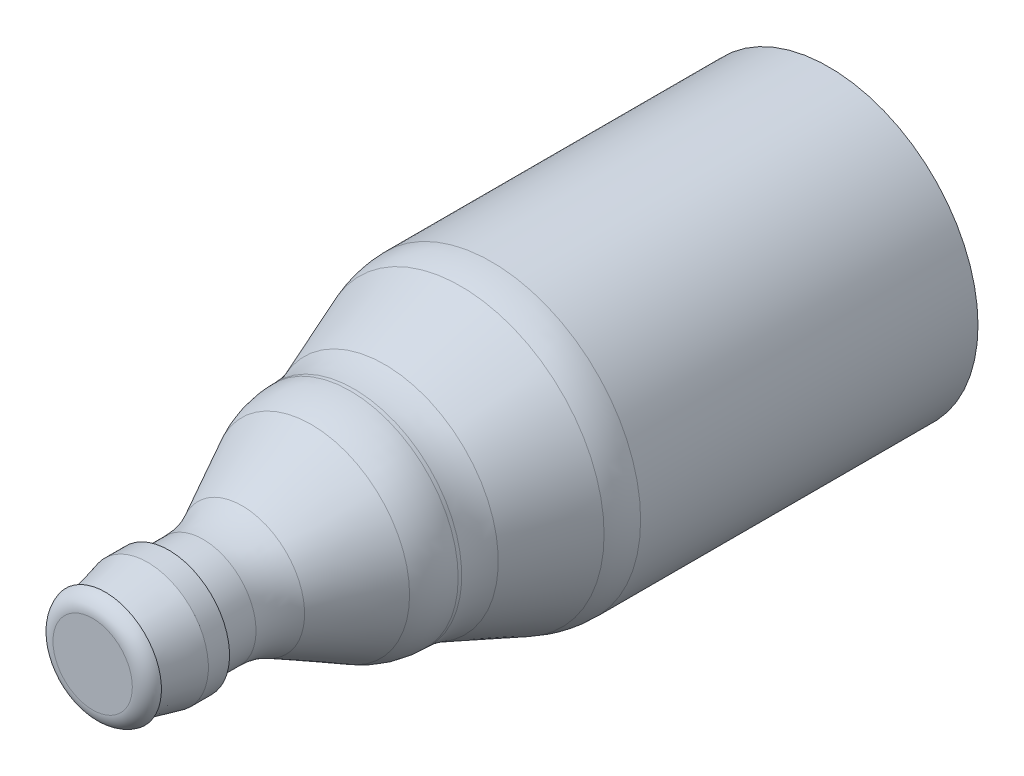
ISO-10303-21;
HEADER;
FILE_DESCRIPTION(('STEP AP214'),'2;1');
FILE_NAME('part.step','',(''),(''),'','','');
FILE_SCHEMA(('AUTOMOTIVE_DESIGN { 1 0 10303 214 1 1 1 1 }'));
ENDSEC;
DATA;
#1=APPLICATION_CONTEXT('core data for automotive mechanical design processes');
#2=APPLICATION_PROTOCOL_DEFINITION('international standard','automotive_design',2000,#1);
#3=PRODUCT_CONTEXT('',#1,'mechanical');
#4=PRODUCT('Part','Part','',(#3));
#5=PRODUCT_RELATED_PRODUCT_CATEGORY('part','',(#4));
#6=PRODUCT_DEFINITION_FORMATION('','',#4);
#7=PRODUCT_DEFINITION_CONTEXT('part definition',#1,'design');
#8=PRODUCT_DEFINITION('design','',#6,#7);
#9=PRODUCT_DEFINITION_SHAPE('','',#8);
#10=(LENGTH_UNIT() NAMED_UNIT(*) SI_UNIT(.MILLI.,.METRE.));
#11=(NAMED_UNIT(*) PLANE_ANGLE_UNIT() SI_UNIT($,.RADIAN.));
#12=(NAMED_UNIT(*) SI_UNIT($,.STERADIAN.) SOLID_ANGLE_UNIT());
#13=UNCERTAINTY_MEASURE_WITH_UNIT(LENGTH_MEASURE(1.E-05),#10,'distance_accuracy_value','');
#14=(GEOMETRIC_REPRESENTATION_CONTEXT(3) GLOBAL_UNCERTAINTY_ASSIGNED_CONTEXT((#13)) GLOBAL_UNIT_ASSIGNED_CONTEXT((#10,
#11,#12)) REPRESENTATION_CONTEXT('',''));
#15=CARTESIAN_POINT('',(0.,0.,0.));
#16=DIRECTION('',(0.,0.,1.));
#17=DIRECTION('',(1.,0.,0.));
#18=AXIS2_PLACEMENT_3D('',#15,#16,#17);
#19=CARTESIAN_POINT('',(0.,0.,10.));
#20=DIRECTION('',(0.,0.,-1.));
#21=DIRECTION('',(-1.,0.,0.));
#22=AXIS2_PLACEMENT_3D('',#19,#20,#21);
#23=CYLINDRICAL_SURFACE('',#22,35.25);
#24=CARTESIAN_POINT('',(0.,0.,79.7379890800758));
#25=DIRECTION('',(0.,0.,1.));
#26=DIRECTION('',(1.,0.,0.));
#27=AXIS2_PLACEMENT_3D('',#24,#25,#26);
#28=CIRCLE('',#27,35.25);
#29=CARTESIAN_POINT('',(35.25,0.,79.7379890800758));
#30=VERTEX_POINT('',#29);
#31=EDGE_CURVE('E10',#30,#30,#28,.F.);
#32=ORIENTED_EDGE('',*,*,#31,.T.);
#33=EDGE_LOOP('',(#32));
#34=FACE_BOUND('',#33,.T.);
#35=CARTESIAN_POINT('',(0.,0.,0.));
#36=DIRECTION('',(0.,0.,1.));
#37=DIRECTION('',(1.,0.,0.));
#38=AXIS2_PLACEMENT_3D('',#35,#36,#37);
#39=CIRCLE('',#38,35.25);
#40=CARTESIAN_POINT('',(35.25,0.,0.));
#41=VERTEX_POINT('',#40);
#42=EDGE_CURVE('E65',#41,#41,#39,.T.);
#43=ORIENTED_EDGE('',*,*,#42,.T.);
#44=EDGE_LOOP('',(#43));
#45=FACE_BOUND('',#44,.T.);
#46=ADVANCED_FACE('F30',(#34,#45),#23,.T.);
#47=CARTESIAN_POINT('',(0.,0.,0.));
#48=DIRECTION('',(0.,0.,1.));
#49=DIRECTION('',(1.,0.,0.));
#50=AXIS2_PLACEMENT_3D('',#47,#48,#49);
#51=PLANE('',#50);
#52=ORIENTED_EDGE('',*,*,#42,.F.);
#53=EDGE_LOOP('',(#52));
#54=FACE_BOUND('',#53,.T.);
#55=ADVANCED_FACE('F105',(#54),#51,.F.);
#56=CARTESIAN_POINT('',(0.,0.,83.5));
#57=DIRECTION('',(0.,0.,-1.));
#58=DIRECTION('',(-1.,0.,0.));
#59=AXIS2_PLACEMENT_3D('',#56,#57,#58);
#60=CONICAL_SURFACE('',#59,35.25,0.371856073848581);
#61=CARTESIAN_POINT('',(0.,0.,104.995105390091));
#62=DIRECTION('',(0.,0.,-1.));
#63=DIRECTION('',(-1.,0.,0.));
#64=AXIS2_PLACEMENT_3D('',#61,#62,#63);
#65=CIRCLE('',#64,26.8669088978644);
#66=CARTESIAN_POINT('',(-26.8669088978644,0.,104.995105390091));
#67=VERTEX_POINT('',#66);
#68=EDGE_CURVE('E45',#67,#67,#65,.T.);
#69=ORIENTED_EDGE('',*,*,#68,.T.);
#70=EDGE_LOOP('',(#69));
#71=FACE_BOUND('',#70,.T.);
#72=CARTESIAN_POINT('',(0.,0.,87.0048946099087));
#73=DIRECTION('',(0.,0.,-1.));
#74=DIRECTION('',(-1.,0.,0.));
#75=AXIS2_PLACEMENT_3D('',#72,#73,#74);
#76=CIRCLE('',#75,33.8830911021356);
#77=CARTESIAN_POINT('',(-33.8830911021356,0.,87.0048946099087));
#78=VERTEX_POINT('',#77);
#79=EDGE_CURVE('E50',#78,#78,#76,.F.);
#80=ORIENTED_EDGE('',*,*,#79,.T.);
#81=EDGE_LOOP('',(#80));
#82=FACE_BOUND('',#81,.T.);
#83=ADVANCED_FACE('F109',(#71,#82),#60,.T.);
#84=CARTESIAN_POINT('',(0.,0.,0.));
#85=DIRECTION('',(0.,0.,-1.));
#86=DIRECTION('',(-1.,0.,0.));
#87=AXIS2_PLACEMENT_3D('',#84,#85,#86);
#88=CYLINDRICAL_SURFACE('',#87,25.5);
#89=CARTESIAN_POINT('',(0.,0.,112.262010919924));
#90=DIRECTION('',(0.,0.,-1.));
#91=DIRECTION('',(-1.,0.,0.));
#92=AXIS2_PLACEMENT_3D('',#89,#90,#91);
#93=CIRCLE('',#92,25.5);
#94=CARTESIAN_POINT('',(-25.5,0.,112.262010919924));
#95=VERTEX_POINT('',#94);
#96=EDGE_CURVE('E37',#95,#95,#93,.F.);
#97=ORIENTED_EDGE('',*,*,#96,.T.);
#98=EDGE_LOOP('',(#97));
#99=FACE_BOUND('',#98,.T.);
#100=CARTESIAN_POINT('',(0.,0.,113.110760604291));
#101=DIRECTION('',(0.,0.,1.));
#102=DIRECTION('',(1.,0.,0.));
#103=AXIS2_PLACEMENT_3D('',#100,#101,#102);
#104=CIRCLE('',#103,25.5);
#105=CARTESIAN_POINT('',(25.5,0.,113.110760604291));
#106=VERTEX_POINT('',#105);
#107=EDGE_CURVE('E41',#106,#106,#104,.F.);
#108=ORIENTED_EDGE('',*,*,#107,.T.);
#109=EDGE_LOOP('',(#108));
#110=FACE_BOUND('',#109,.T.);
#111=ADVANCED_FACE('F116',(#99,#110),#88,.T.);
#112=CARTESIAN_POINT('',(0.,0.,118.));
#113=DIRECTION('',(0.,0.,-1.));
#114=DIRECTION('',(-1.,0.,0.));
#115=AXIS2_PLACEMENT_3D('',#112,#113,#114);
#116=CONICAL_SURFACE('',#115,25.5,0.479519291992596);
#117=CARTESIAN_POINT('',(0.,0.,138.662184662869));
#118=DIRECTION('',(0.,0.,-1.));
#119=DIRECTION('',(-1.,0.,0.));
#120=AXIS2_PLACEMENT_3D('',#117,#118,#119);
#121=CIRCLE('',#120,14.7556639753081);
#122=CARTESIAN_POINT('',(-14.7556639753081,0.,138.662184662869));
#123=VERTEX_POINT('',#122);
#124=EDGE_CURVE('E56',#123,#123,#121,.T.);
#125=ORIENTED_EDGE('',*,*,#124,.T.);
#126=EDGE_LOOP('',(#125));
#127=FACE_BOUND('',#126,.T.);
#128=CARTESIAN_POINT('',(0.,0.,122.337815337131));
#129=DIRECTION('',(0.,0.,1.));
#130=DIRECTION('',(1.,0.,0.));
#131=AXIS2_PLACEMENT_3D('',#128,#129,#130);
#132=CIRCLE('',#131,23.2443360246919);
#133=CARTESIAN_POINT('',(23.2443360246919,0.,122.337815337131));
#134=VERTEX_POINT('',#133);
#135=EDGE_CURVE('E59',#134,#134,#132,.T.);
#136=ORIENTED_EDGE('',*,*,#135,.T.);
#137=EDGE_LOOP('',(#136));
#138=FACE_BOUND('',#137,.T.);
#139=ADVANCED_FACE('F120',(#127,#138),#116,.T.);
#140=CARTESIAN_POINT('',(0.,0.,0.));
#141=DIRECTION('',(0.,0.,-1.));
#142=DIRECTION('',(-1.,0.,0.));
#143=AXIS2_PLACEMENT_3D('',#140,#141,#142);
#144=CYLINDRICAL_SURFACE('',#143,12.5);
#145=CARTESIAN_POINT('',(0.,0.,147.889239395709));
#146=DIRECTION('',(0.,0.,-1.));
#147=DIRECTION('',(-1.,0.,0.));
#148=AXIS2_PLACEMENT_3D('',#145,#146,#147);
#149=CIRCLE('',#148,12.5);
#150=CARTESIAN_POINT('',(-12.5,0.,147.889239395709));
#151=VERTEX_POINT('',#150);
#152=EDGE_CURVE('E53',#151,#151,#149,.F.);
#153=ORIENTED_EDGE('',*,*,#152,.T.);
#154=EDGE_LOOP('',(#153));
#155=FACE_BOUND('',#154,.T.);
#156=CARTESIAN_POINT('',(0.,0.,156.));
#157=DIRECTION('',(0.,0.,-1.));
#158=DIRECTION('',(-1.,0.,0.));
#159=AXIS2_PLACEMENT_3D('',#156,#157,#158);
#160=CIRCLE('',#159,12.5);
#161=CARTESIAN_POINT('',(-12.5,0.,156.));
#162=VERTEX_POINT('',#161);
#163=EDGE_CURVE('E68',#162,#162,#160,.T.);
#164=ORIENTED_EDGE('',*,*,#163,.T.);
#165=EDGE_LOOP('',(#164));
#166=FACE_BOUND('',#165,.T.);
#167=ADVANCED_FACE('F123',(#155,#166),#144,.T.);
#168=CARTESIAN_POINT('',(-12.5,0.,156.));
#169=DIRECTION('',(0.,0.,-1.));
#170=DIRECTION('',(-1.,0.,0.));
#171=AXIS2_PLACEMENT_3D('',#168,#169,#170);
#172=PLANE('',#171);
#173=CARTESIAN_POINT('',(0.,0.,156.));
#174=DIRECTION('',(0.,0.,-1.));
#175=DIRECTION('',(-1.,0.,0.));
#176=AXIS2_PLACEMENT_3D('',#173,#174,#175);
#177=CIRCLE('',#176,14.35);
#178=CARTESIAN_POINT('',(-14.35,0.,156.));
#179=VERTEX_POINT('',#178);
#180=EDGE_CURVE('E71',#179,#179,#177,.T.);
#181=ORIENTED_EDGE('',*,*,#180,.T.);
#182=EDGE_LOOP('',(#181));
#183=FACE_BOUND('',#182,.T.);
#184=ORIENTED_EDGE('',*,*,#163,.F.);
#185=EDGE_LOOP('',(#184));
#186=FACE_BOUND('',#185,.T.);
#187=ADVANCED_FACE('F127',(#183,#186),#172,.T.);
#188=CARTESIAN_POINT('',(0.,0.,0.));
#189=DIRECTION('',(0.,0.,-1.));
#190=DIRECTION('',(-1.,0.,0.));
#191=AXIS2_PLACEMENT_3D('',#188,#189,#190);
#192=CYLINDRICAL_SURFACE('',#191,14.35);
#193=CARTESIAN_POINT('',(0.,0.,161.));
#194=DIRECTION('',(0.,0.,-1.));
#195=DIRECTION('',(-1.,0.,0.));
#196=AXIS2_PLACEMENT_3D('',#193,#194,#195);
#197=CIRCLE('',#196,14.35);
#198=CARTESIAN_POINT('',(-14.35,0.,161.));
#199=VERTEX_POINT('',#198);
#200=EDGE_CURVE('E74',#199,#199,#197,.T.);
#201=ORIENTED_EDGE('',*,*,#200,.T.);
#202=EDGE_LOOP('',(#201));
#203=FACE_BOUND('',#202,.T.);
#204=ORIENTED_EDGE('',*,*,#180,.F.);
#205=EDGE_LOOP('',(#204));
#206=FACE_BOUND('',#205,.T.);
#207=ADVANCED_FACE('F131',(#203,#206),#192,.T.);
#208=CARTESIAN_POINT('',(0.,0.,161.));
#209=DIRECTION('',(0.,0.,-1.));
#210=DIRECTION('',(-1.,0.,0.));
#211=AXIS2_PLACEMENT_3D('',#208,#209,#210);
#212=CONICAL_SURFACE('',#211,14.35,0.230811960402668);
#213=CARTESIAN_POINT('',(0.,0.,171.));
#214=DIRECTION('',(0.,0.,-1.));
#215=DIRECTION('',(-1.,0.,0.));
#216=AXIS2_PLACEMENT_3D('',#213,#214,#215);
#217=CIRCLE('',#216,12.);
#218=CARTESIAN_POINT('',(-12.,0.,171.));
#219=VERTEX_POINT('',#218);
#220=EDGE_CURVE('E77',#219,#219,#217,.T.);
#221=ORIENTED_EDGE('',*,*,#220,.T.);
#222=EDGE_LOOP('',(#221));
#223=FACE_BOUND('',#222,.T.);
#224=ORIENTED_EDGE('',*,*,#200,.F.);
#225=EDGE_LOOP('',(#224));
#226=FACE_BOUND('',#225,.T.);
#227=ADVANCED_FACE('F135',(#223,#226),#212,.T.);
#228=CARTESIAN_POINT('',(-12.,0.,171.));
#229=DIRECTION('',(0.,0.,-1.));
#230=DIRECTION('',(-1.,0.,0.));
#231=AXIS2_PLACEMENT_3D('',#228,#229,#230);
#232=PLANE('',#231);
#233=CARTESIAN_POINT('',(0.,0.,171.));
#234=DIRECTION('',(0.,0.,-1.));
#235=DIRECTION('',(-1.,0.,0.));
#236=AXIS2_PLACEMENT_3D('',#233,#234,#235);
#237=CIRCLE('',#236,13.25);
#238=CARTESIAN_POINT('',(-13.25,0.,171.));
#239=VERTEX_POINT('',#238);
#240=EDGE_CURVE('E80',#239,#239,#237,.T.);
#241=ORIENTED_EDGE('',*,*,#240,.T.);
#242=EDGE_LOOP('',(#241));
#243=FACE_BOUND('',#242,.T.);
#244=ORIENTED_EDGE('',*,*,#220,.F.);
#245=EDGE_LOOP('',(#244));
#246=FACE_BOUND('',#245,.T.);
#247=ADVANCED_FACE('F84',(#243,#246),#232,.T.);
#248=CARTESIAN_POINT('',(-12.5,0.,174.));
#249=DIRECTION('',(0.,0.,1.));
#250=DIRECTION('',(1.,0.,0.));
#251=AXIS2_PLACEMENT_3D('',#248,#249,#250);
#252=PLANE('',#251);
#253=CARTESIAN_POINT('',(0.,0.,174.));
#254=DIRECTION('',(0.,0.,1.));
#255=DIRECTION('',(1.,0.,0.));
#256=AXIS2_PLACEMENT_3D('',#253,#254,#255);
#257=CIRCLE('',#256,9.37701665379256);
#258=CARTESIAN_POINT('',(9.37701665379256,0.,174.));
#259=VERTEX_POINT('',#258);
#260=EDGE_CURVE('E62',#259,#259,#257,.T.);
#261=ORIENTED_EDGE('',*,*,#260,.T.);
#262=EDGE_LOOP('',(#261));
#263=FACE_BOUND('',#262,.T.);
#264=ADVANCED_FACE('F90',(#263),#252,.T.);
#265=CARTESIAN_POINT('',(0.,0.,170.));
#266=DIRECTION('',(0.,0.,-1.));
#267=DIRECTION('',(-1.,0.,0.));
#268=AXIS2_PLACEMENT_3D('',#265,#266,#267);
#269=TOROIDAL_SURFACE('',#268,9.37701665379256,4.);
#270=ORIENTED_EDGE('',*,*,#260,.F.);
#271=EDGE_LOOP('',(#270));
#272=FACE_BOUND('',#271,.T.);
#273=ORIENTED_EDGE('',*,*,#240,.F.);
#274=EDGE_LOOP('',(#273));
#275=FACE_BOUND('',#274,.T.);
#276=ADVANCED_FACE('F87',(#272,#275),#269,.T.);
#277=CARTESIAN_POINT('',(0.,0.,147.889239395709));
#278=DIRECTION('',(0.,0.,-1.));
#279=DIRECTION('',(-1.,0.,0.));
#280=AXIS2_PLACEMENT_3D('',#277,#278,#279);
#281=TOROIDAL_SURFACE('',#280,32.5,20.);
#282=ORIENTED_EDGE('',*,*,#152,.F.);
#283=EDGE_LOOP('',(#282));
#284=FACE_BOUND('',#283,.T.);
#285=ORIENTED_EDGE('',*,*,#124,.F.);
#286=EDGE_LOOP('',(#285));
#287=FACE_BOUND('',#286,.T.);
#288=ADVANCED_FACE('F89',(#284,#287),#281,.F.);
#289=CARTESIAN_POINT('',(0.,0.,112.262010919924));
#290=DIRECTION('',(0.,0.,-1.));
#291=DIRECTION('',(-1.,0.,0.));
#292=AXIS2_PLACEMENT_3D('',#289,#290,#291);
#293=TOROIDAL_SURFACE('',#292,45.5,20.);
#294=ORIENTED_EDGE('',*,*,#96,.F.);
#295=EDGE_LOOP('',(#294));
#296=FACE_BOUND('',#295,.T.);
#297=ORIENTED_EDGE('',*,*,#68,.F.);
#298=EDGE_LOOP('',(#297));
#299=FACE_BOUND('',#298,.T.);
#300=ADVANCED_FACE('F97',(#296,#299),#293,.F.);
#301=CARTESIAN_POINT('',(0.,0.,79.7379890800758));
#302=DIRECTION('',(0.,0.,1.));
#303=DIRECTION('',(1.,0.,0.));
#304=AXIS2_PLACEMENT_3D('',#301,#302,#303);
#305=DEGENERATE_TOROIDAL_SURFACE('',#304,15.25,20.,.T.);
#306=ORIENTED_EDGE('',*,*,#79,.F.);
#307=EDGE_LOOP('',(#306));
#308=FACE_BOUND('',#307,.T.);
#309=ORIENTED_EDGE('',*,*,#31,.F.);
#310=EDGE_LOOP('',(#309));
#311=FACE_BOUND('',#310,.T.);
#312=ADVANCED_FACE('F199',(#308,#311),#305,.T.);
#313=CARTESIAN_POINT('',(0.,0.,113.110760604291));
#314=DIRECTION('',(0.,0.,1.));
#315=DIRECTION('',(1.,0.,0.));
#316=AXIS2_PLACEMENT_3D('',#313,#314,#315);
#317=DEGENERATE_TOROIDAL_SURFACE('',#316,5.49999999999998,20.,.T.);
#318=ORIENTED_EDGE('',*,*,#135,.F.);
#319=EDGE_LOOP('',(#318));
#320=FACE_BOUND('',#319,.T.);
#321=ORIENTED_EDGE('',*,*,#107,.F.);
#322=EDGE_LOOP('',(#321));
#323=FACE_BOUND('',#322,.T.);
#324=ADVANCED_FACE('F32',(#320,#323),#317,.T.);
#325=CLOSED_SHELL('',(#46,#55,#83,#111,#139,#167,#187,#207,#227,#247,#264,#276,#288,#300,#312,#324));
#326=MANIFOLD_SOLID_BREP('B2',#325);
#327=ADVANCED_BREP_SHAPE_REPRESENTATION('',(#18,#326),#14);
#328=SHAPE_DEFINITION_REPRESENTATION(#9,#327);
ENDSEC;
END-ISO-10303-21;
